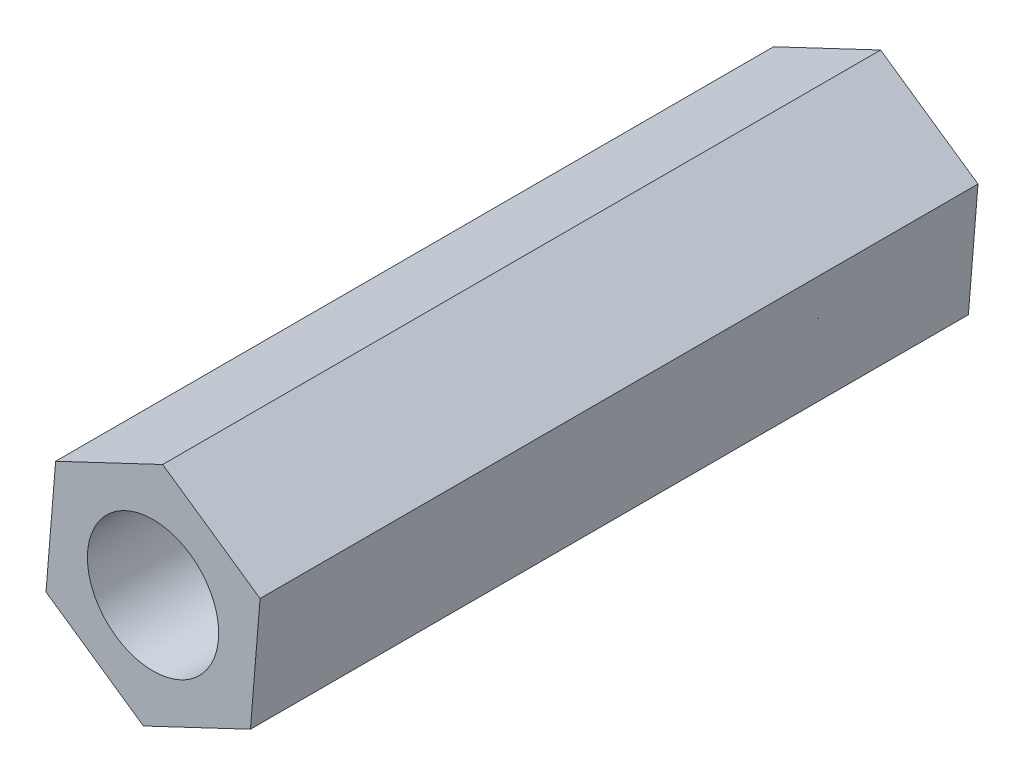
ISO-10303-21;
HEADER;
FILE_DESCRIPTION(('STEP AP214'),'2;1');
FILE_NAME('part.step','',(''),(''),'','','');
FILE_SCHEMA(('AUTOMOTIVE_DESIGN { 1 0 10303 214 1 1 1 1 }'));
ENDSEC;
DATA;
#1=APPLICATION_CONTEXT('core data for automotive mechanical design processes');
#2=APPLICATION_PROTOCOL_DEFINITION('international standard','automotive_design',2000,#1);
#3=PRODUCT_CONTEXT('',#1,'mechanical');
#4=PRODUCT('Part','Part','',(#3));
#5=PRODUCT_RELATED_PRODUCT_CATEGORY('part','',(#4));
#6=PRODUCT_DEFINITION_FORMATION('','',#4);
#7=PRODUCT_DEFINITION_CONTEXT('part definition',#1,'design');
#8=PRODUCT_DEFINITION('design','',#6,#7);
#9=PRODUCT_DEFINITION_SHAPE('','',#8);
#10=(LENGTH_UNIT() NAMED_UNIT(*) SI_UNIT(.MILLI.,.METRE.));
#11=(NAMED_UNIT(*) PLANE_ANGLE_UNIT() SI_UNIT($,.RADIAN.));
#12=(NAMED_UNIT(*) SI_UNIT($,.STERADIAN.) SOLID_ANGLE_UNIT());
#13=UNCERTAINTY_MEASURE_WITH_UNIT(LENGTH_MEASURE(1.E-05),#10,'distance_accuracy_value','');
#14=(GEOMETRIC_REPRESENTATION_CONTEXT(3) GLOBAL_UNCERTAINTY_ASSIGNED_CONTEXT((#13)) GLOBAL_UNIT_ASSIGNED_CONTEXT((#10,
#11,#12)) REPRESENTATION_CONTEXT('',''));
#15=CARTESIAN_POINT('',(0.,0.,0.));
#16=DIRECTION('',(0.,0.,1.));
#17=DIRECTION('',(1.,0.,0.));
#18=AXIS2_PLACEMENT_3D('',#15,#16,#17);
#19=CARTESIAN_POINT('',(0.23444486528615,2.8772154834969,5.));
#20=DIRECTION('',(0.428014880588203,-0.903771686873995,0.));
#21=DIRECTION('',(0.903771686873995,0.428014880588203,0.));
#22=AXIS2_PLACEMENT_3D('',#19,#20,#21);
#23=PLANE('',#22);
#24=DIRECTION('',(-0.903771686873995,-0.428014880588203,0.));
#25=VECTOR('',#24,1.);
#26=CARTESIAN_POINT('',(0.23444486528615,2.8772154834969,0.));
#27=LINE('',#26,#25);
#28=CARTESIAN_POINT('',(0.23444486528615,2.8772154834969,0.));
#29=VERTEX_POINT('',#28);
#30=CARTESIAN_POINT('',(-2.37451926822717,1.64164295087308,0.));
#31=VERTEX_POINT('',#30);
#32=EDGE_CURVE('E125',#29,#31,#27,.T.);
#33=ORIENTED_EDGE('',*,*,#32,.T.);
#34=DIRECTION('',(0.,0.,-1.));
#35=VECTOR('',#34,1.);
#36=CARTESIAN_POINT('',(-2.37451926822717,1.64164295087308,5.));
#37=LINE('',#36,#35);
#38=CARTESIAN_POINT('',(-2.37451926822718,1.64164295087305,17.5));
#39=VERTEX_POINT('',#38);
#40=EDGE_CURVE('E11',#39,#31,#37,.T.);
#41=ORIENTED_EDGE('',*,*,#40,.F.);
#42=DIRECTION('',(-0.90377168687399,-0.428014880588212,0.));
#43=VECTOR('',#42,1.);
#44=CARTESIAN_POINT('',(0.234444865286119,2.8772154834969,17.5));
#45=LINE('',#44,#43);
#46=CARTESIAN_POINT('',(0.234444865286119,2.8772154834969,17.5));
#47=VERTEX_POINT('',#46);
#48=EDGE_CURVE('E119',#47,#39,#45,.T.);
#49=ORIENTED_EDGE('',*,*,#48,.F.);
#50=DIRECTION('',(0.,0.,-1.));
#51=VECTOR('',#50,1.);
#52=CARTESIAN_POINT('',(0.23444486528615,2.8772154834969,5.));
#53=LINE('',#52,#51);
#54=EDGE_CURVE('E135',#47,#29,#53,.T.);
#55=ORIENTED_EDGE('',*,*,#54,.T.);
#56=EDGE_LOOP('',(#33,#41,#49,#55));
#57=FACE_BOUND('',#56,.T.);
#58=ADVANCED_FACE('F32',(#57),#23,.F.);
#59=CARTESIAN_POINT('',(-2.37451926822717,1.64164295087308,5.));
#60=DIRECTION('',(0.996696680348096,-0.0812140836498501,0.));
#61=DIRECTION('',(0.0812140836498501,0.996696680348096,0.));
#62=AXIS2_PLACEMENT_3D('',#59,#60,#61);
#63=PLANE('',#62);
#64=DIRECTION('',(-0.0812140836498501,-0.996696680348096,0.));
#65=VECTOR('',#64,1.);
#66=CARTESIAN_POINT('',(-2.37451926822717,1.64164295087308,0.));
#67=LINE('',#66,#65);
#68=CARTESIAN_POINT('',(-2.60896413351331,-1.23557253262382,0.));
#69=VERTEX_POINT('',#68);
#70=EDGE_CURVE('E128',#31,#69,#67,.T.);
#71=ORIENTED_EDGE('',*,*,#70,.T.);
#72=DIRECTION('',(0.,0.,-1.));
#73=VECTOR('',#72,1.);
#74=CARTESIAN_POINT('',(-2.60896413351331,-1.23557253262382,5.));
#75=LINE('',#74,#73);
#76=CARTESIAN_POINT('',(-2.6089641335133,-1.23557253262385,17.5));
#77=VERTEX_POINT('',#76);
#78=EDGE_CURVE('E39',#77,#69,#75,.T.);
#79=ORIENTED_EDGE('',*,*,#78,.F.);
#80=DIRECTION('',(-0.08121408364984,-0.996696680348097,0.));
#81=VECTOR('',#80,1.);
#82=CARTESIAN_POINT('',(-2.37451926822718,1.64164295087305,17.5));
#83=LINE('',#82,#81);
#84=EDGE_CURVE('E109',#39,#77,#83,.T.);
#85=ORIENTED_EDGE('',*,*,#84,.F.);
#86=ORIENTED_EDGE('',*,*,#40,.T.);
#87=EDGE_LOOP('',(#71,#79,#85,#86));
#88=FACE_BOUND('',#87,.T.);
#89=ADVANCED_FACE('F148',(#88),#63,.F.);
#90=CARTESIAN_POINT('',(-2.60896413351331,-1.23557253262382,5.));
#91=DIRECTION('',(0.568681799759893,0.822557603224145,0.));
#92=DIRECTION('',(-0.822557603224145,0.568681799759893,0.));
#93=AXIS2_PLACEMENT_3D('',#90,#91,#92);
#94=PLANE('',#93);
#95=DIRECTION('',(0.822557603224145,-0.568681799759893,0.));
#96=VECTOR('',#95,1.);
#97=CARTESIAN_POINT('',(-2.60896413351331,-1.23557253262382,0.));
#98=LINE('',#97,#96);
#99=CARTESIAN_POINT('',(-0.234444865286149,-2.8772154834969,0.));
#100=VERTEX_POINT('',#99);
#101=EDGE_CURVE('E92',#69,#100,#98,.T.);
#102=ORIENTED_EDGE('',*,*,#101,.T.);
#103=DIRECTION('',(0.,0.,-1.));
#104=VECTOR('',#103,1.);
#105=CARTESIAN_POINT('',(-0.234444865286149,-2.8772154834969,5.));
#106=LINE('',#105,#104);
#107=CARTESIAN_POINT('',(-0.234444865286121,-2.8772154834969,17.5));
#108=VERTEX_POINT('',#107);
#109=EDGE_CURVE('E85',#108,#100,#106,.T.);
#110=ORIENTED_EDGE('',*,*,#109,.F.);
#111=DIRECTION('',(0.82255760322415,-0.568681799759885,0.));
#112=VECTOR('',#111,1.);
#113=CARTESIAN_POINT('',(-2.6089641335133,-1.23557253262385,17.5));
#114=LINE('',#113,#112);
#115=EDGE_CURVE('E90',#77,#108,#114,.T.);
#116=ORIENTED_EDGE('',*,*,#115,.F.);
#117=ORIENTED_EDGE('',*,*,#78,.T.);
#118=EDGE_LOOP('',(#102,#110,#116,#117));
#119=FACE_BOUND('',#118,.T.);
#120=ADVANCED_FACE('F87',(#119),#94,.F.);
#121=CARTESIAN_POINT('',(-0.234444865286149,-2.8772154834969,5.));
#122=DIRECTION('',(-0.428014880588203,0.903771686873995,0.));
#123=DIRECTION('',(-0.903771686873995,-0.428014880588203,0.));
#124=AXIS2_PLACEMENT_3D('',#121,#122,#123);
#125=PLANE('',#124);
#126=DIRECTION('',(0.903771686873995,0.428014880588203,0.));
#127=VECTOR('',#126,1.);
#128=CARTESIAN_POINT('',(-0.234444865286149,-2.8772154834969,0.));
#129=LINE('',#128,#127);
#130=CARTESIAN_POINT('',(2.37451926822717,-1.64164295087308,0.));
#131=VERTEX_POINT('',#130);
#132=EDGE_CURVE('E131',#100,#131,#129,.T.);
#133=ORIENTED_EDGE('',*,*,#132,.T.);
#134=DIRECTION('',(0.,0.,-1.));
#135=VECTOR('',#134,1.);
#136=CARTESIAN_POINT('',(2.37451926822717,-1.64164295087308,5.));
#137=LINE('',#136,#135);
#138=CARTESIAN_POINT('',(2.37451926822718,-1.64164295087305,17.5));
#139=VERTEX_POINT('',#138);
#140=EDGE_CURVE('E95',#139,#131,#137,.T.);
#141=ORIENTED_EDGE('',*,*,#140,.F.);
#142=DIRECTION('',(0.90377168687399,0.428014880588212,0.));
#143=VECTOR('',#142,1.);
#144=CARTESIAN_POINT('',(-0.234444865286121,-2.8772154834969,17.5));
#145=LINE('',#144,#143);
#146=EDGE_CURVE('E98',#108,#139,#145,.T.);
#147=ORIENTED_EDGE('',*,*,#146,.F.);
#148=ORIENTED_EDGE('',*,*,#109,.T.);
#149=EDGE_LOOP('',(#133,#141,#147,#148));
#150=FACE_BOUND('',#149,.T.);
#151=ADVANCED_FACE('F99',(#150),#125,.F.);
#152=CARTESIAN_POINT('',(2.37451926822717,-1.64164295087308,5.));
#153=DIRECTION('',(-0.996696680348096,0.0812140836498501,0.));
#154=DIRECTION('',(-0.0812140836498501,-0.996696680348096,0.));
#155=AXIS2_PLACEMENT_3D('',#152,#153,#154);
#156=PLANE('',#155);
#157=DIRECTION('',(0.0812140836498501,0.996696680348096,0.));
#158=VECTOR('',#157,1.);
#159=CARTESIAN_POINT('',(2.37451926822717,-1.64164295087308,0.));
#160=LINE('',#159,#158);
#161=CARTESIAN_POINT('',(2.60896413351331,1.23557253262382,0.));
#162=VERTEX_POINT('',#161);
#163=EDGE_CURVE('E54',#131,#162,#160,.T.);
#164=ORIENTED_EDGE('',*,*,#163,.T.);
#165=DIRECTION('',(0.,0.,-1.));
#166=VECTOR('',#165,1.);
#167=CARTESIAN_POINT('',(2.60896413351331,1.23557253262382,5.));
#168=LINE('',#167,#166);
#169=CARTESIAN_POINT('',(2.6089641335133,1.23557253262385,17.5));
#170=VERTEX_POINT('',#169);
#171=EDGE_CURVE('E137',#170,#162,#168,.T.);
#172=ORIENTED_EDGE('',*,*,#171,.F.);
#173=DIRECTION('',(0.08121408364984,0.996696680348097,0.));
#174=VECTOR('',#173,1.);
#175=CARTESIAN_POINT('',(2.37451926822718,-1.64164295087305,17.5));
#176=LINE('',#175,#174);
#177=EDGE_CURVE('E103',#139,#170,#176,.T.);
#178=ORIENTED_EDGE('',*,*,#177,.F.);
#179=ORIENTED_EDGE('',*,*,#140,.T.);
#180=EDGE_LOOP('',(#164,#172,#178,#179));
#181=FACE_BOUND('',#180,.T.);
#182=ADVANCED_FACE('F143',(#181),#156,.F.);
#183=CARTESIAN_POINT('',(2.60896413351331,1.23557253262382,5.));
#184=DIRECTION('',(-0.568681799759893,-0.822557603224144,0.));
#185=DIRECTION('',(0.822557603224144,-0.568681799759893,0.));
#186=AXIS2_PLACEMENT_3D('',#183,#184,#185);
#187=PLANE('',#186);
#188=DIRECTION('',(-0.822557603224144,0.568681799759893,0.));
#189=VECTOR('',#188,1.);
#190=CARTESIAN_POINT('',(2.60896413351331,1.23557253262382,0.));
#191=LINE('',#190,#189);
#192=EDGE_CURVE('E46',#162,#29,#191,.T.);
#193=ORIENTED_EDGE('',*,*,#192,.T.);
#194=ORIENTED_EDGE('',*,*,#54,.F.);
#195=DIRECTION('',(-0.82255760322415,0.568681799759884,0.));
#196=VECTOR('',#195,1.);
#197=CARTESIAN_POINT('',(2.6089641335133,1.23557253262385,17.5));
#198=LINE('',#197,#196);
#199=EDGE_CURVE('E116',#170,#47,#198,.T.);
#200=ORIENTED_EDGE('',*,*,#199,.F.);
#201=ORIENTED_EDGE('',*,*,#171,.T.);
#202=EDGE_LOOP('',(#193,#194,#200,#201));
#203=FACE_BOUND('',#202,.T.);
#204=ADVANCED_FACE('F146',(#203),#187,.F.);
#205=CARTESIAN_POINT('',(0.,0.,0.));
#206=DIRECTION('',(0.,0.,1.));
#207=DIRECTION('',(1.,0.,0.));
#208=AXIS2_PLACEMENT_3D('',#205,#206,#207);
#209=PLANE('',#208);
#210=CARTESIAN_POINT('',(0.,0.,0.));
#211=DIRECTION('',(0.,0.,1.));
#212=DIRECTION('',(1.,0.,0.));
#213=AXIS2_PLACEMENT_3D('',#210,#211,#212);
#214=CIRCLE('',#213,1.6);
#215=CARTESIAN_POINT('',(1.6,0.,0.));
#216=VERTEX_POINT('',#215);
#217=EDGE_CURVE('E122',#216,#216,#214,.T.);
#218=ORIENTED_EDGE('',*,*,#217,.T.);
#219=EDGE_LOOP('',(#218));
#220=FACE_BOUND('',#219,.T.);
#221=ORIENTED_EDGE('',*,*,#32,.F.);
#222=ORIENTED_EDGE('',*,*,#192,.F.);
#223=ORIENTED_EDGE('',*,*,#163,.F.);
#224=ORIENTED_EDGE('',*,*,#132,.F.);
#225=ORIENTED_EDGE('',*,*,#101,.F.);
#226=ORIENTED_EDGE('',*,*,#70,.F.);
#227=EDGE_LOOP('',(#221,#222,#223,#224,#225,#226));
#228=FACE_BOUND('',#227,.T.);
#229=ADVANCED_FACE('F142',(#220,#228),#209,.F.);
#230=CARTESIAN_POINT('',(0.,0.,0.));
#231=DIRECTION('',(0.,0.,1.));
#232=DIRECTION('',(1.,0.,0.));
#233=AXIS2_PLACEMENT_3D('',#230,#231,#232);
#234=CYLINDRICAL_SURFACE('',#233,1.6);
#235=ORIENTED_EDGE('',*,*,#217,.F.);
#236=EDGE_LOOP('',(#235));
#237=FACE_BOUND('',#236,.T.);
#238=CARTESIAN_POINT('',(0.,0.,17.5));
#239=DIRECTION('',(0.,0.,-1.));
#240=DIRECTION('',(-1.,0.,0.));
#241=AXIS2_PLACEMENT_3D('',#238,#239,#240);
#242=CIRCLE('',#241,1.6);
#243=CARTESIAN_POINT('',(-1.6,0.,17.5));
#244=VERTEX_POINT('',#243);
#245=EDGE_CURVE('E110',#244,#244,#242,.T.);
#246=ORIENTED_EDGE('',*,*,#245,.F.);
#247=EDGE_LOOP('',(#246));
#248=FACE_BOUND('',#247,.T.);
#249=ADVANCED_FACE('F164',(#237,#248),#234,.F.);
#250=CARTESIAN_POINT('',(0.,0.,17.5));
#251=DIRECTION('',(0.,0.,1.));
#252=DIRECTION('',(1.,0.,0.));
#253=AXIS2_PLACEMENT_3D('',#250,#251,#252);
#254=PLANE('',#253);
#255=ORIENTED_EDGE('',*,*,#245,.T.);
#256=EDGE_LOOP('',(#255));
#257=FACE_BOUND('',#256,.T.);
#258=ORIENTED_EDGE('',*,*,#115,.T.);
#259=ORIENTED_EDGE('',*,*,#146,.T.);
#260=ORIENTED_EDGE('',*,*,#177,.T.);
#261=ORIENTED_EDGE('',*,*,#199,.T.);
#262=ORIENTED_EDGE('',*,*,#48,.T.);
#263=ORIENTED_EDGE('',*,*,#84,.T.);
#264=EDGE_LOOP('',(#258,#259,#260,#261,#262,#263));
#265=FACE_BOUND('',#264,.T.);
#266=ADVANCED_FACE('F106',(#257,#265),#254,.T.);
#267=CLOSED_SHELL('',(#58,#89,#120,#151,#182,#204,#229,#249,#266));
#268=MANIFOLD_SOLID_BREP('B2',#267);
#269=ADVANCED_BREP_SHAPE_REPRESENTATION('',(#18,#268),#14);
#270=SHAPE_DEFINITION_REPRESENTATION(#9,#269);
ENDSEC;
END-ISO-10303-21;
